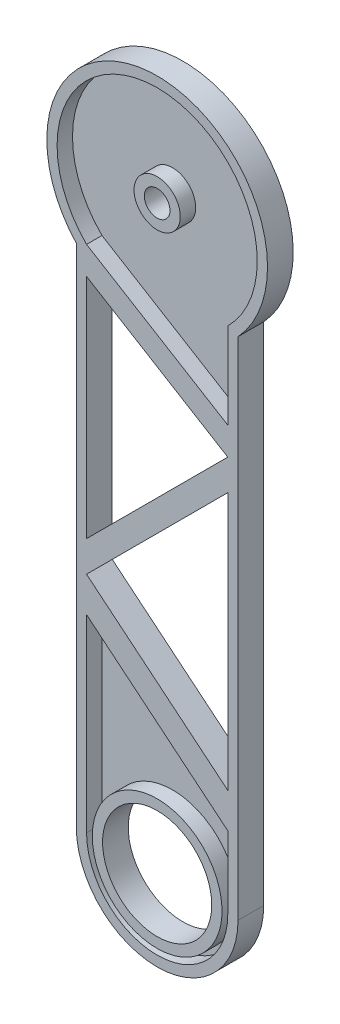
ISO-10303-21;
HEADER;
FILE_DESCRIPTION(('STEP AP214'),'2;1');
FILE_NAME('part.step','',(''),(''),'','','');
FILE_SCHEMA(('AUTOMOTIVE_DESIGN { 1 0 10303 214 1 1 1 1 }'));
ENDSEC;
DATA;
#1=APPLICATION_CONTEXT('core data for automotive mechanical design processes');
#2=APPLICATION_PROTOCOL_DEFINITION('international standard','automotive_design',2000,#1);
#3=PRODUCT_CONTEXT('',#1,'mechanical');
#4=PRODUCT('Part','Part','',(#3));
#5=PRODUCT_RELATED_PRODUCT_CATEGORY('part','',(#4));
#6=PRODUCT_DEFINITION_FORMATION('','',#4);
#7=PRODUCT_DEFINITION_CONTEXT('part definition',#1,'design');
#8=PRODUCT_DEFINITION('design','',#6,#7);
#9=PRODUCT_DEFINITION_SHAPE('','',#8);
#10=(LENGTH_UNIT() NAMED_UNIT(*) SI_UNIT(.MILLI.,.METRE.));
#11=(NAMED_UNIT(*) PLANE_ANGLE_UNIT() SI_UNIT($,.RADIAN.));
#12=(NAMED_UNIT(*) SI_UNIT($,.STERADIAN.) SOLID_ANGLE_UNIT());
#13=UNCERTAINTY_MEASURE_WITH_UNIT(LENGTH_MEASURE(1.E-05),#10,'distance_accuracy_value','');
#14=(GEOMETRIC_REPRESENTATION_CONTEXT(3) GLOBAL_UNCERTAINTY_ASSIGNED_CONTEXT((#13)) GLOBAL_UNIT_ASSIGNED_CONTEXT((#10,
#11,#12)) REPRESENTATION_CONTEXT('',''));
#15=CARTESIAN_POINT('',(0.,0.,0.));
#16=DIRECTION('',(0.,0.,1.));
#17=DIRECTION('',(1.,0.,0.));
#18=AXIS2_PLACEMENT_3D('',#15,#16,#17);
#19=CARTESIAN_POINT('',(8.60560747663553,108.315703390679,2.54));
#20=DIRECTION('',(0.,0.,-1.));
#21=DIRECTION('',(-1.,0.,0.));
#22=AXIS2_PLACEMENT_3D('',#19,#20,#21);
#23=PLANE('',#22);
#24=CARTESIAN_POINT('',(8.60560747663554,-35.2514018691589,2.54));
#25=DIRECTION('',(0.,0.,-1.));
#26=DIRECTION('',(-1.,0.,0.));
#27=AXIS2_PLACEMENT_3D('',#24,#25,#26);
#28=CIRCLE('',#27,16.04);
#29=CARTESIAN_POINT('',(-7.43439252336446,-35.2514018691589,2.54));
#30=VERTEX_POINT('',#29);
#31=EDGE_CURVE('E261',#30,#30,#28,.F.);
#32=ORIENTED_EDGE('',*,*,#31,.F.);
#33=EDGE_LOOP('',(#32));
#34=FACE_BOUND('',#33,.T.);
#35=DIRECTION('',(0.771176398523915,-0.636621522067612,0.));
#36=VECTOR('',#35,1.);
#37=CARTESIAN_POINT('',(26.0656074766353,-17.336893719603,2.54));
#38=LINE('',#37,#36);
#39=CARTESIAN_POINT('',(-8.8543925233641,11.4902638453225,2.54));
#40=VERTEX_POINT('',#39);
#41=CARTESIAN_POINT('',(26.0656074766355,-17.3368937196032,2.54));
#42=VERTEX_POINT('',#41);
#43=EDGE_CURVE('E219',#40,#42,#38,.T.);
#44=ORIENTED_EDGE('',*,*,#43,.F.);
#45=DIRECTION('',(0.,-1.,0.));
#46=VECTOR('',#45,1.);
#47=CARTESIAN_POINT('',(-8.85439252336455,108.315703390679,2.54));
#48=LINE('',#47,#46);
#49=CARTESIAN_POINT('',(-8.85439252336418,-35.2514018691589,2.54));
#50=VERTEX_POINT('',#49);
#51=EDGE_CURVE('E271',#40,#50,#48,.T.);
#52=ORIENTED_EDGE('',*,*,#51,.T.);
#53=CARTESIAN_POINT('',(8.60560747663554,-35.2514018691589,2.54));
#54=DIRECTION('',(0.,0.,-1.));
#55=DIRECTION('',(-1.,0.,0.));
#56=AXIS2_PLACEMENT_3D('',#53,#54,#55);
#57=CIRCLE('',#56,17.4599999999997);
#58=CARTESIAN_POINT('',(26.0656074766355,-35.2514018691589,2.54));
#59=VERTEX_POINT('',#58);
#60=EDGE_CURVE('E278',#50,#59,#57,.F.);
#61=ORIENTED_EDGE('',*,*,#60,.T.);
#62=DIRECTION('',(0.,1.,0.));
#63=VECTOR('',#62,1.);
#64=CARTESIAN_POINT('',(26.0656074766355,108.315703390679,2.54));
#65=LINE('',#64,#63);
#66=EDGE_CURVE('E272',#59,#42,#65,.T.);
#67=ORIENTED_EDGE('',*,*,#66,.T.);
#68=EDGE_LOOP('',(#44,#52,#61,#67));
#69=FACE_BOUND('',#68,.T.);
#70=ADVANCED_FACE('F45',(#34,#69),#23,.F.);
#71=CARTESIAN_POINT('',(-8.85439252336446,89.7485981308411,6.35));
#72=DIRECTION('',(1.,0.,0.));
#73=DIRECTION('',(0.,1.,0.));
#74=AXIS2_PLACEMENT_3D('',#71,#72,#73);
#75=PLANE('',#74);
#76=ORIENTED_EDGE('',*,*,#51,.F.);
#77=DIRECTION('',(0.,0.,-1.));
#78=VECTOR('',#77,1.);
#79=CARTESIAN_POINT('',(-8.85439252336415,11.4902638453225,57.5752702965007));
#80=LINE('',#79,#78);
#81=CARTESIAN_POINT('',(-8.8543925233641,11.4902638453225,6.35));
#82=VERTEX_POINT('',#81);
#83=EDGE_CURVE('E232',#82,#40,#80,.T.);
#84=ORIENTED_EDGE('',*,*,#83,.F.);
#85=DIRECTION('',(0.,-1.,0.));
#86=VECTOR('',#85,1.);
#87=CARTESIAN_POINT('',(-8.85439252336455,108.315703390679,6.35));
#88=LINE('',#87,#86);
#89=CARTESIAN_POINT('',(-8.85439252336389,-35.2514018691589,6.35));
#90=VERTEX_POINT('',#89);
#91=EDGE_CURVE('E305',#82,#90,#88,.T.);
#92=ORIENTED_EDGE('',*,*,#91,.T.);
#93=DIRECTION('',(0.,0.,-1.));
#94=VECTOR('',#93,1.);
#95=CARTESIAN_POINT('',(-8.85439252336418,-35.2514018691589,6.35));
#96=LINE('',#95,#94);
#97=EDGE_CURVE('E290',#90,#50,#96,.T.);
#98=ORIENTED_EDGE('',*,*,#97,.T.);
#99=EDGE_LOOP('',(#76,#84,#92,#98));
#100=FACE_BOUND('',#99,.T.);
#101=ADVANCED_FACE('F400',(#100),#75,.T.);
#102=CARTESIAN_POINT('',(26.0656074766355,89.7485981308411,6.35));
#103=DIRECTION('',(-1.,0.,0.));
#104=DIRECTION('',(0.,-1.,0.));
#105=AXIS2_PLACEMENT_3D('',#102,#103,#104);
#106=PLANE('',#105);
#107=DIRECTION('',(0.,0.,1.));
#108=VECTOR('',#107,1.);
#109=CARTESIAN_POINT('',(26.0656074766353,55.0613922197192,-52.496878545208));
#110=LINE('',#109,#108);
#111=CARTESIAN_POINT('',(26.0656074766355,55.0613922197195,0.));
#112=VERTEX_POINT('',#111);
#113=CARTESIAN_POINT('',(26.0656074766355,55.0613922197195,6.35));
#114=VERTEX_POINT('',#113);
#115=EDGE_CURVE('E166',#112,#114,#110,.T.);
#116=ORIENTED_EDGE('',*,*,#115,.F.);
#117=DIRECTION('',(0.,1.,0.));
#118=VECTOR('',#117,1.);
#119=CARTESIAN_POINT('',(26.0656074766355,-8.6857653452065,0.));
#120=LINE('',#119,#118);
#121=CARTESIAN_POINT('',(26.0656074766356,-8.68576534520649,0.));
#122=VERTEX_POINT('',#121);
#123=EDGE_CURVE('E170',#122,#112,#120,.T.);
#124=ORIENTED_EDGE('',*,*,#123,.F.);
#125=DIRECTION('',(0.,0.,-1.));
#126=VECTOR('',#125,1.);
#127=CARTESIAN_POINT('',(26.0656074766355,-8.6857653452065,57.5752702965007));
#128=LINE('',#127,#126);
#129=CARTESIAN_POINT('',(26.0656074766355,-8.6857653452065,6.35));
#130=VERTEX_POINT('',#129);
#131=EDGE_CURVE('E61',#130,#122,#128,.T.);
#132=ORIENTED_EDGE('',*,*,#131,.F.);
#133=DIRECTION('',(0.,1.,0.));
#134=VECTOR('',#133,1.);
#135=CARTESIAN_POINT('',(26.0656074766355,108.315703390679,6.35));
#136=LINE('',#135,#134);
#137=EDGE_CURVE('E173',#130,#114,#136,.T.);
#138=ORIENTED_EDGE('',*,*,#137,.T.);
#139=EDGE_LOOP('',(#116,#124,#132,#138));
#140=FACE_BOUND('',#139,.T.);
#141=ADVANCED_FACE('F168',(#140),#106,.T.);
#142=CARTESIAN_POINT('',(26.0656074766353,-35.2514018691589,6.35));
#143=VERTEX_POINT('',#142);
#144=CARTESIAN_POINT('',(26.0656074766355,-17.3368937196032,6.35));
#145=VERTEX_POINT('',#144);
#146=EDGE_CURVE('E296',#143,#145,#136,.T.);
#147=ORIENTED_EDGE('',*,*,#146,.T.);
#148=DIRECTION('',(0.,0.,-1.));
#149=VECTOR('',#148,1.);
#150=CARTESIAN_POINT('',(26.0656074766353,-17.336893719603,57.5752702965007));
#151=LINE('',#150,#149);
#152=EDGE_CURVE('E236',#145,#42,#151,.T.);
#153=ORIENTED_EDGE('',*,*,#152,.T.);
#154=ORIENTED_EDGE('',*,*,#66,.F.);
#155=DIRECTION('',(0.,0.,1.));
#156=VECTOR('',#155,1.);
#157=CARTESIAN_POINT('',(26.0656074766355,-35.2514018691589,6.35));
#158=LINE('',#157,#156);
#159=EDGE_CURVE('E295',#143,#59,#158,.F.);
#160=ORIENTED_EDGE('',*,*,#159,.F.);
#161=EDGE_LOOP('',(#147,#153,#154,#160));
#162=FACE_BOUND('',#161,.T.);
#163=ADVANCED_FACE('F416',(#162),#106,.T.);
#164=CARTESIAN_POINT('',(8.60560747663553,108.315703390679,2.54));
#165=DIRECTION('',(0.,0.,-1.));
#166=DIRECTION('',(-1.,0.,0.));
#167=AXIS2_PLACEMENT_3D('',#164,#165,#166);
#168=CIRCLE('',#167,5.715);
#169=CARTESIAN_POINT('',(2.89060747663553,108.315703390679,2.54));
#170=VERTEX_POINT('',#169);
#171=EDGE_CURVE('E260',#170,#170,#168,.F.);
#172=ORIENTED_EDGE('',*,*,#171,.F.);
#173=EDGE_LOOP('',(#172));
#174=FACE_BOUND('',#173,.T.);
#175=DIRECTION('',(-0.854455957534544,0.519523836444225,0.));
#176=VECTOR('',#175,1.);
#177=CARTESIAN_POINT('',(-8.85439252336447,90.7741863085969,2.54));
#178=LINE('',#177,#176);
#179=CARTESIAN_POINT('',(26.0656074766355,69.542229051281,2.54));
#180=VERTEX_POINT('',#179);
#181=CARTESIAN_POINT('',(-8.85439252336447,90.7741863085969,2.54));
#182=VERTEX_POINT('',#181);
#183=EDGE_CURVE('E214',#180,#182,#178,.T.);
#184=ORIENTED_EDGE('',*,*,#183,.F.);
#185=CARTESIAN_POINT('',(26.0656074766355,90.7741863085969,2.54));
#186=VERTEX_POINT('',#185);
#187=EDGE_CURVE('E277',#180,#186,#65,.T.);
#188=ORIENTED_EDGE('',*,*,#187,.T.);
#189=CARTESIAN_POINT('',(8.60560747663553,108.315703390679,2.54));
#190=DIRECTION('',(0.,0.,-1.));
#191=DIRECTION('',(-1.,0.,0.));
#192=AXIS2_PLACEMENT_3D('',#189,#190,#191);
#193=CIRCLE('',#192,24.7498772025433);
#194=EDGE_CURVE('E267',#186,#182,#193,.F.);
#195=ORIENTED_EDGE('',*,*,#194,.T.);
#196=EDGE_LOOP('',(#184,#188,#195));
#197=FACE_BOUND('',#196,.T.);
#198=ADVANCED_FACE('F403',(#174,#197),#23,.F.);
#199=DIRECTION('',(0.,0.,1.));
#200=VECTOR('',#199,1.);
#201=CARTESIAN_POINT('',(-8.85439252336418,27.761392219719,-52.496878545208));
#202=LINE('',#201,#200);
#203=CARTESIAN_POINT('',(-8.85439252336418,27.761392219719,0.));
#204=VERTEX_POINT('',#203);
#205=CARTESIAN_POINT('',(-8.85439252336418,27.761392219719,6.35));
#206=VERTEX_POINT('',#205);
#207=EDGE_CURVE('E252',#204,#206,#202,.T.);
#208=ORIENTED_EDGE('',*,*,#207,.F.);
#209=DIRECTION('',(0.,-1.,0.));
#210=VECTOR('',#209,1.);
#211=CARTESIAN_POINT('',(-8.85439252336444,83.9133494770353,0.));
#212=LINE('',#211,#210);
#213=CARTESIAN_POINT('',(-8.85439252336444,83.9133494770353,0.));
#214=VERTEX_POINT('',#213);
#215=EDGE_CURVE('E186',#214,#204,#212,.T.);
#216=ORIENTED_EDGE('',*,*,#215,.F.);
#217=DIRECTION('',(0.,0.,-1.));
#218=VECTOR('',#217,1.);
#219=CARTESIAN_POINT('',(-8.85439252336444,83.9133494770353,57.5752702965007));
#220=LINE('',#219,#218);
#221=CARTESIAN_POINT('',(-8.85439252336444,83.9133494770353,6.35));
#222=VERTEX_POINT('',#221);
#223=EDGE_CURVE('E218',#222,#214,#220,.T.);
#224=ORIENTED_EDGE('',*,*,#223,.F.);
#225=EDGE_CURVE('E308',#222,#206,#88,.T.);
#226=ORIENTED_EDGE('',*,*,#225,.T.);
#227=EDGE_LOOP('',(#208,#216,#224,#226));
#228=FACE_BOUND('',#227,.T.);
#229=ADVANCED_FACE('F410',(#228),#75,.T.);
#230=ORIENTED_EDGE('',*,*,#187,.F.);
#231=DIRECTION('',(0.,0.,-1.));
#232=VECTOR('',#231,1.);
#233=CARTESIAN_POINT('',(26.0656074766355,69.542229051281,57.5752702965007));
#234=LINE('',#233,#232);
#235=CARTESIAN_POINT('',(26.0656074766355,69.542229051281,6.35));
#236=VERTEX_POINT('',#235);
#237=EDGE_CURVE('E222',#236,#180,#234,.T.);
#238=ORIENTED_EDGE('',*,*,#237,.F.);
#239=CARTESIAN_POINT('',(26.0656074766355,90.7741863085969,6.35));
#240=VERTEX_POINT('',#239);
#241=EDGE_CURVE('E313',#236,#240,#136,.T.);
#242=ORIENTED_EDGE('',*,*,#241,.T.);
#243=DIRECTION('',(0.,0.,-1.));
#244=VECTOR('',#243,1.);
#245=CARTESIAN_POINT('',(26.0656074766355,90.7741863085969,6.35));
#246=LINE('',#245,#244);
#247=EDGE_CURVE('E291',#240,#186,#246,.T.);
#248=ORIENTED_EDGE('',*,*,#247,.T.);
#249=EDGE_LOOP('',(#230,#238,#242,#248));
#250=FACE_BOUND('',#249,.T.);
#251=ADVANCED_FACE('F423',(#250),#106,.T.);
#252=CARTESIAN_POINT('',(8.60560747663553,108.315703390679,6.35));
#253=DIRECTION('',(0.,0.,-1.));
#254=DIRECTION('',(-1.,0.,0.));
#255=AXIS2_PLACEMENT_3D('',#252,#253,#254);
#256=PLANE('',#255);
#257=CARTESIAN_POINT('',(8.60560747663554,-35.2514018691589,6.35));
#258=DIRECTION('',(0.,0.,1.));
#259=DIRECTION('',(1.,0.,0.));
#260=AXIS2_PLACEMENT_3D('',#257,#258,#259);
#261=CIRCLE('',#260,13.5);
#262=CARTESIAN_POINT('',(22.1056074766355,-35.2514018691589,6.35));
#263=VERTEX_POINT('',#262);
#264=EDGE_CURVE('E330',#263,#263,#261,.T.);
#265=ORIENTED_EDGE('',*,*,#264,.F.);
#266=EDGE_LOOP('',(#265));
#267=FACE_BOUND('',#266,.T.);
#268=CARTESIAN_POINT('',(8.60560747663554,-35.2514018691589,6.35));
#269=DIRECTION('',(0.,0.,-1.));
#270=DIRECTION('',(-1.,0.,0.));
#271=AXIS2_PLACEMENT_3D('',#268,#269,#270);
#272=CIRCLE('',#271,16.04);
#273=CARTESIAN_POINT('',(-7.43439252336446,-35.2514018691589,6.35));
#274=VERTEX_POINT('',#273);
#275=EDGE_CURVE('E265',#274,#274,#272,.F.);
#276=ORIENTED_EDGE('',*,*,#275,.T.);
#277=EDGE_LOOP('',(#276));
#278=FACE_BOUND('',#277,.T.);
#279=ADVANCED_FACE('F475',(#267,#278),#256,.F.);
#280=CARTESIAN_POINT('',(8.60560747663553,108.315703390679,6.35));
#281=DIRECTION('',(0.,0.,1.));
#282=DIRECTION('',(1.,0.,0.));
#283=AXIS2_PLACEMENT_3D('',#280,#281,#282);
#284=CIRCLE('',#283,3.175);
#285=CARTESIAN_POINT('',(11.7806074766355,108.315703390679,6.35));
#286=VERTEX_POINT('',#285);
#287=EDGE_CURVE('E322',#286,#286,#284,.T.);
#288=ORIENTED_EDGE('',*,*,#287,.F.);
#289=EDGE_LOOP('',(#288));
#290=FACE_BOUND('',#289,.T.);
#291=CARTESIAN_POINT('',(8.60560747663553,108.315703390679,6.35));
#292=DIRECTION('',(0.,0.,-1.));
#293=DIRECTION('',(-1.,0.,0.));
#294=AXIS2_PLACEMENT_3D('',#291,#292,#293);
#295=CIRCLE('',#294,5.715);
#296=CARTESIAN_POINT('',(2.89060747663553,108.315703390679,6.35));
#297=VERTEX_POINT('',#296);
#298=EDGE_CURVE('E266',#297,#297,#295,.F.);
#299=ORIENTED_EDGE('',*,*,#298,.T.);
#300=EDGE_LOOP('',(#299));
#301=FACE_BOUND('',#300,.T.);
#302=ADVANCED_FACE('F473',(#290,#301),#256,.F.);
#303=DIRECTION('',(-0.771176398523915,0.636621522067612,0.));
#304=VECTOR('',#303,1.);
#305=CARTESIAN_POINT('',(26.0656074766353,-17.336893719603,6.35));
#306=LINE('',#305,#304);
#307=EDGE_CURVE('E207',#145,#82,#306,.T.);
#308=ORIENTED_EDGE('',*,*,#307,.F.);
#309=ORIENTED_EDGE('',*,*,#146,.F.);
#310=CARTESIAN_POINT('',(8.60560747663554,-35.2514018691589,6.35));
#311=DIRECTION('',(0.,0.,-1.));
#312=DIRECTION('',(-1.,0.,0.));
#313=AXIS2_PLACEMENT_3D('',#310,#311,#312);
#314=CIRCLE('',#313,17.4599999999997);
#315=EDGE_CURVE('E309',#90,#143,#314,.F.);
#316=ORIENTED_EDGE('',*,*,#315,.F.);
#317=ORIENTED_EDGE('',*,*,#91,.F.);
#318=EDGE_LOOP('',(#308,#309,#316,#317));
#319=FACE_BOUND('',#318,.T.);
#320=ORIENTED_EDGE('',*,*,#225,.F.);
#321=DIRECTION('',(-0.854455957534544,0.519523836444225,0.));
#322=VECTOR('',#321,1.);
#323=CARTESIAN_POINT('',(26.0656074766355,62.6813922197195,6.35));
#324=LINE('',#323,#322);
#325=CARTESIAN_POINT('',(26.0656074766355,62.6813922197195,6.35));
#326=VERTEX_POINT('',#325);
#327=EDGE_CURVE('E213',#326,#222,#324,.T.);
#328=ORIENTED_EDGE('',*,*,#327,.F.);
#329=DIRECTION('',(-0.70710678118654,-0.707106781186556,0.));
#330=VECTOR('',#329,1.);
#331=CARTESIAN_POINT('',(-8.85439252336418,27.761392219719,6.35));
#332=LINE('',#331,#330);
#333=EDGE_CURVE('E177',#326,#206,#332,.T.);
#334=ORIENTED_EDGE('',*,*,#333,.T.);
#335=EDGE_LOOP('',(#320,#328,#334));
#336=FACE_BOUND('',#335,.T.);
#337=ORIENTED_EDGE('',*,*,#137,.F.);
#338=DIRECTION('',(0.771176398523917,-0.63662152206761,0.));
#339=VECTOR('',#338,1.);
#340=CARTESIAN_POINT('',(-8.85439252336414,20.141392219719,6.35));
#341=LINE('',#340,#339);
#342=CARTESIAN_POINT('',(-8.85439252336414,20.141392219719,6.35));
#343=VERTEX_POINT('',#342);
#344=EDGE_CURVE('E229',#343,#130,#341,.T.);
#345=ORIENTED_EDGE('',*,*,#344,.F.);
#346=DIRECTION('',(0.707106781186539,0.707106781186556,0.));
#347=VECTOR('',#346,1.);
#348=CARTESIAN_POINT('',(26.0656074766353,55.0613922197192,6.35));
#349=LINE('',#348,#347);
#350=EDGE_CURVE('E212',#343,#114,#349,.T.);
#351=ORIENTED_EDGE('',*,*,#350,.T.);
#352=EDGE_LOOP('',(#337,#345,#351));
#353=FACE_BOUND('',#352,.T.);
#354=CARTESIAN_POINT('',(8.60560747663553,108.315703390679,6.35));
#355=DIRECTION('',(0.,0.,-1.));
#356=DIRECTION('',(-1.,0.,0.));
#357=AXIS2_PLACEMENT_3D('',#354,#355,#356);
#358=CIRCLE('',#357,24.7498772025433);
#359=CARTESIAN_POINT('',(-8.85439252336447,90.7741863085969,6.35));
#360=VERTEX_POINT('',#359);
#361=EDGE_CURVE('E276',#240,#360,#358,.F.);
#362=ORIENTED_EDGE('',*,*,#361,.F.);
#363=ORIENTED_EDGE('',*,*,#241,.F.);
#364=DIRECTION('',(0.854455957534544,-0.519523836444225,0.));
#365=VECTOR('',#364,1.);
#366=CARTESIAN_POINT('',(-8.85439252336447,90.7741863085969,6.35));
#367=LINE('',#366,#365);
#368=EDGE_CURVE('E208',#360,#236,#367,.T.);
#369=ORIENTED_EDGE('',*,*,#368,.F.);
#370=EDGE_LOOP('',(#362,#363,#369));
#371=FACE_BOUND('',#370,.T.);
#372=CARTESIAN_POINT('',(8.60560747663553,108.315703390679,6.35));
#373=DIRECTION('',(0.,0.,1.));
#374=DIRECTION('',(-1.,0.,0.));
#375=AXIS2_PLACEMENT_3D('',#372,#373,#374);
#376=CIRCLE('',#375,27.2898772025433);
#377=CARTESIAN_POINT('',(28.6056074766355,89.7485981308411,6.35));
#378=VERTEX_POINT('',#377);
#379=CARTESIAN_POINT('',(-11.3943925233645,89.7485981308411,6.35));
#380=VERTEX_POINT('',#379);
#381=EDGE_CURVE('E338',#378,#380,#376,.T.);
#382=ORIENTED_EDGE('',*,*,#381,.T.);
#383=DIRECTION('',(0.,-1.,0.));
#384=VECTOR('',#383,1.);
#385=CARTESIAN_POINT('',(-11.3943925233645,89.7485981308411,6.35));
#386=LINE('',#385,#384);
#387=CARTESIAN_POINT('',(-11.3943925233639,-35.2514018691589,6.35));
#388=VERTEX_POINT('',#387);
#389=EDGE_CURVE('E342',#380,#388,#386,.T.);
#390=ORIENTED_EDGE('',*,*,#389,.T.);
#391=CARTESIAN_POINT('',(8.60560747663554,-35.2514018691589,6.35));
#392=DIRECTION('',(0.,0.,1.));
#393=DIRECTION('',(1.,0.,0.));
#394=AXIS2_PLACEMENT_3D('',#391,#392,#393);
#395=CIRCLE('',#394,19.9999999999997);
#396=CARTESIAN_POINT('',(28.6056074766353,-35.2514018691589,6.35));
#397=VERTEX_POINT('',#396);
#398=EDGE_CURVE('E346',#388,#397,#395,.T.);
#399=ORIENTED_EDGE('',*,*,#398,.T.);
#400=DIRECTION('',(0.,1.,0.));
#401=VECTOR('',#400,1.);
#402=CARTESIAN_POINT('',(28.6056074766355,89.7485981308411,6.35));
#403=LINE('',#402,#401);
#404=EDGE_CURVE('E349',#397,#378,#403,.T.);
#405=ORIENTED_EDGE('',*,*,#404,.T.);
#406=EDGE_LOOP('',(#382,#390,#399,#405));
#407=FACE_BOUND('',#406,.T.);
#408=ADVANCED_FACE('F391',(#319,#336,#353,#371,#407),#256,.F.);
#409=CARTESIAN_POINT('',(8.60560747663553,108.315703390679,0.));
#410=DIRECTION('',(0.,0.,-1.));
#411=DIRECTION('',(-1.,0.,0.));
#412=AXIS2_PLACEMENT_3D('',#409,#410,#411);
#413=PLANE('',#412);
#414=DIRECTION('',(-0.707106781186539,-0.707106781186556,0.));
#415=VECTOR('',#414,1.);
#416=CARTESIAN_POINT('',(26.0656074766355,55.0613922197195,0.));
#417=LINE('',#416,#415);
#418=CARTESIAN_POINT('',(-8.85439252336414,20.141392219719,0.));
#419=VERTEX_POINT('',#418);
#420=EDGE_CURVE('E180',#112,#419,#417,.T.);
#421=ORIENTED_EDGE('',*,*,#420,.T.);
#422=DIRECTION('',(0.771176398523917,-0.63662152206761,0.));
#423=VECTOR('',#422,1.);
#424=CARTESIAN_POINT('',(-8.85439252336414,20.141392219719,0.));
#425=LINE('',#424,#423);
#426=EDGE_CURVE('E187',#419,#122,#425,.T.);
#427=ORIENTED_EDGE('',*,*,#426,.T.);
#428=ORIENTED_EDGE('',*,*,#123,.T.);
#429=EDGE_LOOP('',(#421,#427,#428));
#430=FACE_BOUND('',#429,.T.);
#431=ORIENTED_EDGE('',*,*,#215,.T.);
#432=DIRECTION('',(0.70710678118654,0.707106781186556,0.));
#433=VECTOR('',#432,1.);
#434=CARTESIAN_POINT('',(-8.85439252336418,27.761392219719,0.));
#435=LINE('',#434,#433);
#436=CARTESIAN_POINT('',(26.0656074766355,62.6813922197195,0.));
#437=VERTEX_POINT('',#436);
#438=EDGE_CURVE('E199',#204,#437,#435,.T.);
#439=ORIENTED_EDGE('',*,*,#438,.T.);
#440=DIRECTION('',(-0.854455957534544,0.519523836444225,0.));
#441=VECTOR('',#440,1.);
#442=CARTESIAN_POINT('',(26.0656074766355,62.6813922197195,0.));
#443=LINE('',#442,#441);
#444=EDGE_CURVE('E203',#437,#214,#443,.T.);
#445=ORIENTED_EDGE('',*,*,#444,.T.);
#446=EDGE_LOOP('',(#431,#439,#445));
#447=FACE_BOUND('',#446,.T.);
#448=CARTESIAN_POINT('',(8.60560747663554,-35.2514018691589,0.));
#449=DIRECTION('',(0.,0.,1.));
#450=DIRECTION('',(1.,0.,0.));
#451=AXIS2_PLACEMENT_3D('',#448,#449,#450);
#452=CIRCLE('',#451,13.5);
#453=CARTESIAN_POINT('',(22.1056074766355,-35.2514018691589,0.));
#454=VERTEX_POINT('',#453);
#455=EDGE_CURVE('E326',#454,#454,#452,.T.);
#456=ORIENTED_EDGE('',*,*,#455,.T.);
#457=EDGE_LOOP('',(#456));
#458=FACE_BOUND('',#457,.T.);
#459=CARTESIAN_POINT('',(8.60560747663553,108.315703390679,0.));
#460=DIRECTION('',(0.,0.,1.));
#461=DIRECTION('',(-1.,0.,0.));
#462=AXIS2_PLACEMENT_3D('',#459,#460,#461);
#463=CIRCLE('',#462,27.2898772025433);
#464=CARTESIAN_POINT('',(28.6056074766355,89.7485981308411,0.));
#465=VERTEX_POINT('',#464);
#466=CARTESIAN_POINT('',(-11.3943925233645,89.7485981308411,0.));
#467=VERTEX_POINT('',#466);
#468=EDGE_CURVE('E334',#465,#467,#463,.T.);
#469=ORIENTED_EDGE('',*,*,#468,.F.);
#470=DIRECTION('',(0.,1.,0.));
#471=VECTOR('',#470,1.);
#472=CARTESIAN_POINT('',(28.6056074766355,89.7485981308411,0.));
#473=LINE('',#472,#471);
#474=CARTESIAN_POINT('',(28.6056074766353,-35.2514018691589,0.));
#475=VERTEX_POINT('',#474);
#476=EDGE_CURVE('E343',#475,#465,#473,.T.);
#477=ORIENTED_EDGE('',*,*,#476,.F.);
#478=CARTESIAN_POINT('',(8.60560747663554,-35.2514018691589,0.));
#479=DIRECTION('',(0.,0.,1.));
#480=DIRECTION('',(1.,0.,0.));
#481=AXIS2_PLACEMENT_3D('',#478,#479,#480);
#482=CIRCLE('',#481,19.9999999999997);
#483=CARTESIAN_POINT('',(-11.3943925233639,-35.2514018691589,0.));
#484=VERTEX_POINT('',#483);
#485=EDGE_CURVE('E359',#484,#475,#482,.T.);
#486=ORIENTED_EDGE('',*,*,#485,.F.);
#487=DIRECTION('',(0.,-1.,0.));
#488=VECTOR('',#487,1.);
#489=CARTESIAN_POINT('',(-11.3943925233645,89.7485981308411,0.));
#490=LINE('',#489,#488);
#491=EDGE_CURVE('E356',#467,#484,#490,.T.);
#492=ORIENTED_EDGE('',*,*,#491,.F.);
#493=EDGE_LOOP('',(#469,#477,#486,#492));
#494=FACE_BOUND('',#493,.T.);
#495=CARTESIAN_POINT('',(8.60560747663553,108.315703390679,0.));
#496=DIRECTION('',(0.,0.,1.));
#497=DIRECTION('',(1.,0.,0.));
#498=AXIS2_PLACEMENT_3D('',#495,#496,#497);
#499=CIRCLE('',#498,3.175);
#500=CARTESIAN_POINT('',(11.7806074766355,108.315703390679,0.));
#501=VERTEX_POINT('',#500);
#502=EDGE_CURVE('E289',#501,#501,#499,.T.);
#503=ORIENTED_EDGE('',*,*,#502,.T.);
#504=EDGE_LOOP('',(#503));
#505=FACE_BOUND('',#504,.T.);
#506=ADVANCED_FACE('F189',(#430,#447,#458,#494,#505),#413,.T.);
#507=CARTESIAN_POINT('',(8.60560747663553,108.315703390679,6.35));
#508=DIRECTION('',(0.,0.,-1.));
#509=DIRECTION('',(-1.,0.,0.));
#510=AXIS2_PLACEMENT_3D('',#507,#508,#509);
#511=CYLINDRICAL_SURFACE('',#510,27.2898772025433);
#512=ORIENTED_EDGE('',*,*,#468,.T.);
#513=DIRECTION('',(0.,0.,-1.));
#514=VECTOR('',#513,1.);
#515=CARTESIAN_POINT('',(-11.3943925233645,89.7485981308411,6.35));
#516=LINE('',#515,#514);
#517=EDGE_CURVE('E11',#380,#467,#516,.T.);
#518=ORIENTED_EDGE('',*,*,#517,.F.);
#519=ORIENTED_EDGE('',*,*,#381,.F.);
#520=DIRECTION('',(0.,0.,-1.));
#521=VECTOR('',#520,1.);
#522=CARTESIAN_POINT('',(28.6056074766355,89.7485981308411,6.35));
#523=LINE('',#522,#521);
#524=EDGE_CURVE('E352',#378,#465,#523,.T.);
#525=ORIENTED_EDGE('',*,*,#524,.T.);
#526=EDGE_LOOP('',(#512,#518,#519,#525));
#527=FACE_BOUND('',#526,.T.);
#528=ADVANCED_FACE('F47',(#527),#511,.T.);
#529=CARTESIAN_POINT('',(-11.3943925233645,89.7485981308411,6.35));
#530=DIRECTION('',(1.,0.,0.));
#531=DIRECTION('',(0.,1.,0.));
#532=AXIS2_PLACEMENT_3D('',#529,#530,#531);
#533=PLANE('',#532);
#534=ORIENTED_EDGE('',*,*,#491,.T.);
#535=DIRECTION('',(0.,0.,-1.));
#536=VECTOR('',#535,1.);
#537=CARTESIAN_POINT('',(-11.3943925233639,-35.2514018691589,6.35));
#538=LINE('',#537,#536);
#539=EDGE_CURVE('E54',#388,#484,#538,.T.);
#540=ORIENTED_EDGE('',*,*,#539,.F.);
#541=ORIENTED_EDGE('',*,*,#389,.F.);
#542=ORIENTED_EDGE('',*,*,#517,.T.);
#543=EDGE_LOOP('',(#534,#540,#541,#542));
#544=FACE_BOUND('',#543,.T.);
#545=ADVANCED_FACE('F392',(#544),#533,.F.);
#546=CARTESIAN_POINT('',(8.60560747663554,-35.2514018691589,6.35));
#547=DIRECTION('',(0.,0.,-1.));
#548=DIRECTION('',(-1.,0.,0.));
#549=AXIS2_PLACEMENT_3D('',#546,#547,#548);
#550=CYLINDRICAL_SURFACE('',#549,19.9999999999997);
#551=ORIENTED_EDGE('',*,*,#485,.T.);
#552=DIRECTION('',(0.,0.,-1.));
#553=VECTOR('',#552,1.);
#554=CARTESIAN_POINT('',(28.6056074766353,-35.2514018691589,6.35));
#555=LINE('',#554,#553);
#556=EDGE_CURVE('E367',#397,#475,#555,.T.);
#557=ORIENTED_EDGE('',*,*,#556,.F.);
#558=ORIENTED_EDGE('',*,*,#398,.F.);
#559=ORIENTED_EDGE('',*,*,#539,.T.);
#560=EDGE_LOOP('',(#551,#557,#558,#559));
#561=FACE_BOUND('',#560,.T.);
#562=ADVANCED_FACE('F376',(#561),#550,.T.);
#563=CARTESIAN_POINT('',(28.6056074766355,89.7485981308411,6.35));
#564=DIRECTION('',(-1.,0.,0.));
#565=DIRECTION('',(0.,-1.,0.));
#566=AXIS2_PLACEMENT_3D('',#563,#564,#565);
#567=PLANE('',#566);
#568=ORIENTED_EDGE('',*,*,#476,.T.);
#569=ORIENTED_EDGE('',*,*,#524,.F.);
#570=ORIENTED_EDGE('',*,*,#404,.F.);
#571=ORIENTED_EDGE('',*,*,#556,.T.);
#572=EDGE_LOOP('',(#568,#569,#570,#571));
#573=FACE_BOUND('',#572,.T.);
#574=ADVANCED_FACE('F385',(#573),#567,.F.);
#575=CARTESIAN_POINT('',(8.60560747663554,-35.2514018691589,6.35));
#576=DIRECTION('',(0.,0.,-1.));
#577=DIRECTION('',(-1.,0.,0.));
#578=AXIS2_PLACEMENT_3D('',#575,#576,#577);
#579=CYLINDRICAL_SURFACE('',#578,13.5);
#580=ORIENTED_EDGE('',*,*,#264,.T.);
#581=EDGE_LOOP('',(#580));
#582=FACE_BOUND('',#581,.T.);
#583=ORIENTED_EDGE('',*,*,#455,.F.);
#584=EDGE_LOOP('',(#583));
#585=FACE_BOUND('',#584,.T.);
#586=ADVANCED_FACE('F457',(#582,#585),#579,.F.);
#587=CARTESIAN_POINT('',(8.60560747663553,108.315703390679,6.35));
#588=DIRECTION('',(0.,0.,-1.));
#589=DIRECTION('',(-1.,0.,0.));
#590=AXIS2_PLACEMENT_3D('',#587,#588,#589);
#591=CYLINDRICAL_SURFACE('',#590,3.175);
#592=ORIENTED_EDGE('',*,*,#287,.T.);
#593=EDGE_LOOP('',(#592));
#594=FACE_BOUND('',#593,.T.);
#595=ORIENTED_EDGE('',*,*,#502,.F.);
#596=EDGE_LOOP('',(#595));
#597=FACE_BOUND('',#596,.T.);
#598=ADVANCED_FACE('F459',(#594,#597),#591,.F.);
#599=CARTESIAN_POINT('',(8.60560747663553,108.315703390679,6.35));
#600=DIRECTION('',(0.,0.,-1.));
#601=DIRECTION('',(-1.,0.,0.));
#602=AXIS2_PLACEMENT_3D('',#599,#600,#601);
#603=CYLINDRICAL_SURFACE('',#602,24.7498772025433);
#604=ORIENTED_EDGE('',*,*,#194,.F.);
#605=ORIENTED_EDGE('',*,*,#247,.F.);
#606=ORIENTED_EDGE('',*,*,#361,.T.);
#607=DIRECTION('',(0.,0.,-1.));
#608=VECTOR('',#607,1.);
#609=CARTESIAN_POINT('',(-8.85439252336447,90.7741863085969,6.35));
#610=LINE('',#609,#608);
#611=EDGE_CURVE('E286',#360,#182,#610,.T.);
#612=ORIENTED_EDGE('',*,*,#611,.T.);
#613=EDGE_LOOP('',(#604,#605,#606,#612));
#614=FACE_BOUND('',#613,.T.);
#615=ADVANCED_FACE('F466',(#614),#603,.F.);
#616=CARTESIAN_POINT('',(8.60560747663554,-35.2514018691589,6.35));
#617=DIRECTION('',(0.,0.,-1.));
#618=DIRECTION('',(-1.,0.,0.));
#619=AXIS2_PLACEMENT_3D('',#616,#617,#618);
#620=CYLINDRICAL_SURFACE('',#619,17.4599999999997);
#621=ORIENTED_EDGE('',*,*,#60,.F.);
#622=ORIENTED_EDGE('',*,*,#97,.F.);
#623=ORIENTED_EDGE('',*,*,#315,.T.);
#624=ORIENTED_EDGE('',*,*,#159,.T.);
#625=EDGE_LOOP('',(#621,#622,#623,#624));
#626=FACE_BOUND('',#625,.T.);
#627=ADVANCED_FACE('F494',(#626),#620,.F.);
#628=CARTESIAN_POINT('',(8.60560747663554,-35.2514018691589,6.35));
#629=DIRECTION('',(0.,0.,-1.));
#630=DIRECTION('',(-1.,0.,0.));
#631=AXIS2_PLACEMENT_3D('',#628,#629,#630);
#632=CYLINDRICAL_SURFACE('',#631,16.04);
#633=ORIENTED_EDGE('',*,*,#275,.F.);
#634=EDGE_LOOP('',(#633));
#635=FACE_BOUND('',#634,.T.);
#636=ORIENTED_EDGE('',*,*,#31,.T.);
#637=EDGE_LOOP('',(#636));
#638=FACE_BOUND('',#637,.T.);
#639=ADVANCED_FACE('F490',(#635,#638),#632,.T.);
#640=CARTESIAN_POINT('',(8.60560747663553,108.315703390679,6.35));
#641=DIRECTION('',(0.,0.,-1.));
#642=DIRECTION('',(-1.,0.,0.));
#643=AXIS2_PLACEMENT_3D('',#640,#641,#642);
#644=CYLINDRICAL_SURFACE('',#643,5.715);
#645=ORIENTED_EDGE('',*,*,#298,.F.);
#646=EDGE_LOOP('',(#645));
#647=FACE_BOUND('',#646,.T.);
#648=ORIENTED_EDGE('',*,*,#171,.T.);
#649=EDGE_LOOP('',(#648));
#650=FACE_BOUND('',#649,.T.);
#651=ADVANCED_FACE('F493',(#647,#650),#644,.T.);
#652=CARTESIAN_POINT('',(26.0656074766353,55.0613922197192,-52.496878545208));
#653=DIRECTION('',(0.707106781186556,-0.707106781186539,0.));
#654=DIRECTION('',(0.707106781186539,0.707106781186556,0.));
#655=AXIS2_PLACEMENT_3D('',#652,#653,#654);
#656=PLANE('',#655);
#657=DIRECTION('',(0.,0.,1.));
#658=VECTOR('',#657,1.);
#659=CARTESIAN_POINT('',(-8.85439252336418,20.141392219719,-52.496878545208));
#660=LINE('',#659,#658);
#661=EDGE_CURVE('E183',#419,#343,#660,.T.);
#662=ORIENTED_EDGE('',*,*,#661,.F.);
#663=ORIENTED_EDGE('',*,*,#420,.F.);
#664=ORIENTED_EDGE('',*,*,#115,.T.);
#665=ORIENTED_EDGE('',*,*,#350,.F.);
#666=EDGE_LOOP('',(#662,#663,#664,#665));
#667=FACE_BOUND('',#666,.T.);
#668=ADVANCED_FACE('F181',(#667),#656,.T.);
#669=CARTESIAN_POINT('',(-8.85439252336418,27.761392219719,-52.496878545208));
#670=DIRECTION('',(-0.707106781186556,0.707106781186539,0.));
#671=DIRECTION('',(-0.707106781186539,-0.707106781186556,0.));
#672=AXIS2_PLACEMENT_3D('',#669,#670,#671);
#673=PLANE('',#672);
#674=DIRECTION('',(0.,0.,1.));
#675=VECTOR('',#674,1.);
#676=CARTESIAN_POINT('',(26.0656074766353,62.6813922197192,-52.496878545208));
#677=LINE('',#676,#675);
#678=EDGE_CURVE('E69',#437,#326,#677,.T.);
#679=ORIENTED_EDGE('',*,*,#678,.F.);
#680=ORIENTED_EDGE('',*,*,#438,.F.);
#681=ORIENTED_EDGE('',*,*,#207,.T.);
#682=ORIENTED_EDGE('',*,*,#333,.F.);
#683=EDGE_LOOP('',(#679,#680,#681,#682));
#684=FACE_BOUND('',#683,.T.);
#685=ADVANCED_FACE('F448',(#684),#673,.T.);
#686=CARTESIAN_POINT('',(26.0656074766355,62.6813922197195,57.5752702965007));
#687=DIRECTION('',(0.519523836444225,0.854455957534544,0.));
#688=DIRECTION('',(-0.854455957534544,0.519523836444225,0.));
#689=AXIS2_PLACEMENT_3D('',#686,#687,#688);
#690=PLANE('',#689);
#691=ORIENTED_EDGE('',*,*,#678,.T.);
#692=ORIENTED_EDGE('',*,*,#327,.T.);
#693=ORIENTED_EDGE('',*,*,#223,.T.);
#694=ORIENTED_EDGE('',*,*,#444,.F.);
#695=EDGE_LOOP('',(#691,#692,#693,#694));
#696=FACE_BOUND('',#695,.T.);
#697=ADVANCED_FACE('F451',(#696),#690,.F.);
#698=CARTESIAN_POINT('',(-8.85439252336447,90.7741863085969,57.5752702965007));
#699=DIRECTION('',(-0.519523836444225,-0.854455957534544,0.));
#700=DIRECTION('',(0.854455957534544,-0.519523836444225,0.));
#701=AXIS2_PLACEMENT_3D('',#698,#699,#700);
#702=PLANE('',#701);
#703=ORIENTED_EDGE('',*,*,#611,.F.);
#704=ORIENTED_EDGE('',*,*,#368,.T.);
#705=ORIENTED_EDGE('',*,*,#237,.T.);
#706=ORIENTED_EDGE('',*,*,#183,.T.);
#707=EDGE_LOOP('',(#703,#704,#705,#706));
#708=FACE_BOUND('',#707,.T.);
#709=ADVANCED_FACE('F437',(#708),#702,.F.);
#710=CARTESIAN_POINT('',(-8.85439252336414,20.141392219719,57.5752702965007));
#711=DIRECTION('',(-0.63662152206761,-0.771176398523917,0.));
#712=DIRECTION('',(0.771176398523917,-0.63662152206761,0.));
#713=AXIS2_PLACEMENT_3D('',#710,#711,#712);
#714=PLANE('',#713);
#715=ORIENTED_EDGE('',*,*,#661,.T.);
#716=ORIENTED_EDGE('',*,*,#344,.T.);
#717=ORIENTED_EDGE('',*,*,#131,.T.);
#718=ORIENTED_EDGE('',*,*,#426,.F.);
#719=EDGE_LOOP('',(#715,#716,#717,#718));
#720=FACE_BOUND('',#719,.T.);
#721=ADVANCED_FACE('F515',(#720),#714,.F.);
#722=CARTESIAN_POINT('',(26.0656074766353,-17.336893719603,57.5752702965007));
#723=DIRECTION('',(0.636621522067612,0.771176398523915,0.));
#724=DIRECTION('',(-0.771176398523915,0.636621522067612,0.));
#725=AXIS2_PLACEMENT_3D('',#722,#723,#724);
#726=PLANE('',#725);
#727=ORIENTED_EDGE('',*,*,#152,.F.);
#728=ORIENTED_EDGE('',*,*,#307,.T.);
#729=ORIENTED_EDGE('',*,*,#83,.T.);
#730=ORIENTED_EDGE('',*,*,#43,.T.);
#731=EDGE_LOOP('',(#727,#728,#729,#730));
#732=FACE_BOUND('',#731,.T.);
#733=ADVANCED_FACE('F522',(#732),#726,.F.);
#734=CLOSED_SHELL('',(#70,#101,#141,#163,#198,#229,#251,#279,#302,#408,#506,#528,#545,#562,#574,
#586,#598,#615,#627,#639,#651,#668,#685,#697,#709,#721,#733));
#735=MANIFOLD_SOLID_BREP('B2',#734);
#736=ADVANCED_BREP_SHAPE_REPRESENTATION('',(#18,#735),#14);
#737=SHAPE_DEFINITION_REPRESENTATION(#9,#736);
ENDSEC;
END-ISO-10303-21;
